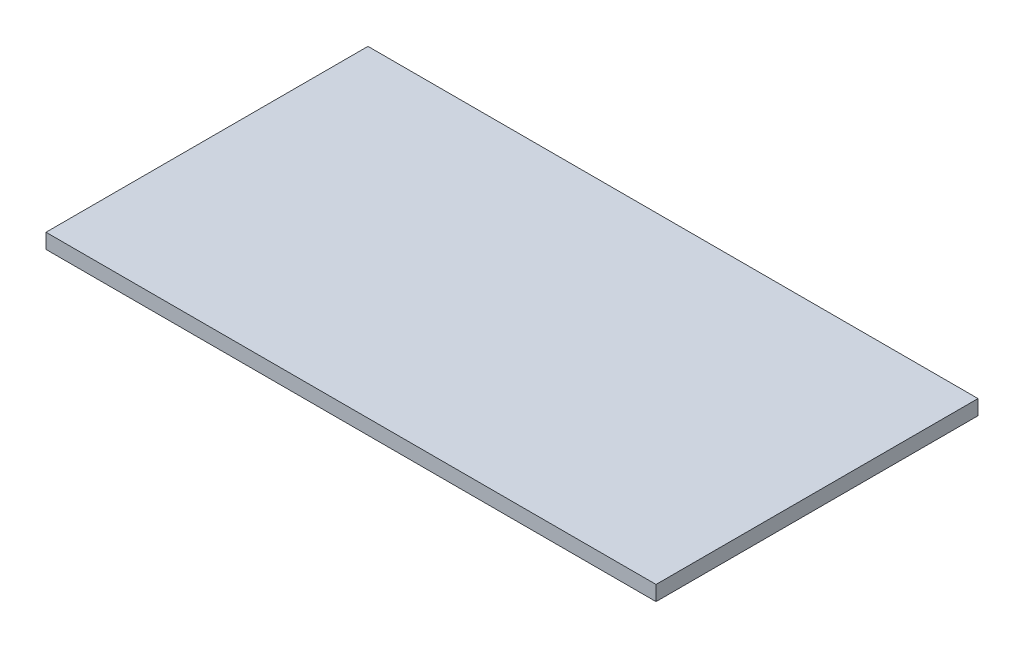
ISO-10303-21;
HEADER;
FILE_DESCRIPTION(('STEP AP214'),'2;1');
FILE_NAME('part.step','',(''),(''),'','','');
FILE_SCHEMA(('AUTOMOTIVE_DESIGN { 1 0 10303 214 1 1 1 1 }'));
ENDSEC;
DATA;
#1=APPLICATION_CONTEXT('core data for automotive mechanical design processes');
#2=APPLICATION_PROTOCOL_DEFINITION('international standard','automotive_design',2000,#1);
#3=PRODUCT_CONTEXT('',#1,'mechanical');
#4=PRODUCT('Part','Part','',(#3));
#5=PRODUCT_RELATED_PRODUCT_CATEGORY('part','',(#4));
#6=PRODUCT_DEFINITION_FORMATION('','',#4);
#7=PRODUCT_DEFINITION_CONTEXT('part definition',#1,'design');
#8=PRODUCT_DEFINITION('design','',#6,#7);
#9=PRODUCT_DEFINITION_SHAPE('','',#8);
#10=(LENGTH_UNIT() NAMED_UNIT(*) SI_UNIT(.MILLI.,.METRE.));
#11=(NAMED_UNIT(*) PLANE_ANGLE_UNIT() SI_UNIT($,.RADIAN.));
#12=(NAMED_UNIT(*) SI_UNIT($,.STERADIAN.) SOLID_ANGLE_UNIT());
#13=UNCERTAINTY_MEASURE_WITH_UNIT(LENGTH_MEASURE(1.E-05),#10,'distance_accuracy_value','');
#14=(GEOMETRIC_REPRESENTATION_CONTEXT(3) GLOBAL_UNCERTAINTY_ASSIGNED_CONTEXT((#13)) GLOBAL_UNIT_ASSIGNED_CONTEXT((#10,
#11,#12)) REPRESENTATION_CONTEXT('',''));
#15=CARTESIAN_POINT('',(0.,0.,0.));
#16=DIRECTION('',(0.,0.,1.));
#17=DIRECTION('',(1.,0.,0.));
#18=AXIS2_PLACEMENT_3D('',#15,#16,#17);
#19=CARTESIAN_POINT('',(114.3,5.588,60.325));
#20=DIRECTION('',(-1.,0.,0.));
#21=DIRECTION('',(0.,0.,1.));
#22=AXIS2_PLACEMENT_3D('',#19,#20,#21);
#23=PLANE('',#22);
#24=DIRECTION('',(0.,0.,-1.));
#25=VECTOR('',#24,1.);
#26=CARTESIAN_POINT('',(114.3,0.,60.325));
#27=LINE('',#26,#25);
#28=CARTESIAN_POINT('',(114.3,0.,60.325));
#29=VERTEX_POINT('',#28);
#30=CARTESIAN_POINT('',(114.3,0.,-60.325));
#31=VERTEX_POINT('',#30);
#32=EDGE_CURVE('E107',#29,#31,#27,.T.);
#33=ORIENTED_EDGE('',*,*,#32,.T.);
#34=DIRECTION('',(0.,-1.,0.));
#35=VECTOR('',#34,1.);
#36=CARTESIAN_POINT('',(114.3,5.588,-60.325));
#37=LINE('',#36,#35);
#38=CARTESIAN_POINT('',(114.3,5.588,-60.325));
#39=VERTEX_POINT('',#38);
#40=EDGE_CURVE('E11',#39,#31,#37,.T.);
#41=ORIENTED_EDGE('',*,*,#40,.F.);
#42=DIRECTION('',(0.,0.,-1.));
#43=VECTOR('',#42,1.);
#44=CARTESIAN_POINT('',(114.3,5.588,60.325));
#45=LINE('',#44,#43);
#46=CARTESIAN_POINT('',(114.3,5.588,60.325));
#47=VERTEX_POINT('',#46);
#48=EDGE_CURVE('E91',#47,#39,#45,.T.);
#49=ORIENTED_EDGE('',*,*,#48,.F.);
#50=DIRECTION('',(0.,-1.,0.));
#51=VECTOR('',#50,1.);
#52=CARTESIAN_POINT('',(114.3,5.588,60.325));
#53=LINE('',#52,#51);
#54=EDGE_CURVE('E103',#47,#29,#53,.T.);
#55=ORIENTED_EDGE('',*,*,#54,.T.);
#56=EDGE_LOOP('',(#33,#41,#49,#55));
#57=FACE_BOUND('',#56,.T.);
#58=ADVANCED_FACE('F39',(#57),#23,.F.);
#59=CARTESIAN_POINT('',(-114.3,5.588,-60.325));
#60=DIRECTION('',(0.,0.,1.));
#61=DIRECTION('',(1.,0.,0.));
#62=AXIS2_PLACEMENT_3D('',#59,#60,#61);
#63=PLANE('',#62);
#64=DIRECTION('',(-1.,0.,0.));
#65=VECTOR('',#64,1.);
#66=CARTESIAN_POINT('',(-114.3,0.,-60.325));
#67=LINE('',#66,#65);
#68=CARTESIAN_POINT('',(-114.3,0.,-60.325));
#69=VERTEX_POINT('',#68);
#70=EDGE_CURVE('E96',#31,#69,#67,.T.);
#71=ORIENTED_EDGE('',*,*,#70,.T.);
#72=DIRECTION('',(0.,-1.,0.));
#73=VECTOR('',#72,1.);
#74=CARTESIAN_POINT('',(-114.3,5.588,-60.325));
#75=LINE('',#74,#73);
#76=CARTESIAN_POINT('',(-114.3,5.588,-60.325));
#77=VERTEX_POINT('',#76);
#78=EDGE_CURVE('E48',#77,#69,#75,.T.);
#79=ORIENTED_EDGE('',*,*,#78,.F.);
#80=DIRECTION('',(-1.,0.,0.));
#81=VECTOR('',#80,1.);
#82=CARTESIAN_POINT('',(-114.3,5.588,-60.325));
#83=LINE('',#82,#81);
#84=EDGE_CURVE('E86',#39,#77,#83,.T.);
#85=ORIENTED_EDGE('',*,*,#84,.F.);
#86=ORIENTED_EDGE('',*,*,#40,.T.);
#87=EDGE_LOOP('',(#71,#79,#85,#86));
#88=FACE_BOUND('',#87,.T.);
#89=ADVANCED_FACE('F95',(#88),#63,.F.);
#90=CARTESIAN_POINT('',(-114.3,5.588,60.325));
#91=DIRECTION('',(1.,0.,0.));
#92=DIRECTION('',(0.,0.,-1.));
#93=AXIS2_PLACEMENT_3D('',#90,#91,#92);
#94=PLANE('',#93);
#95=DIRECTION('',(0.,0.,1.));
#96=VECTOR('',#95,1.);
#97=CARTESIAN_POINT('',(-114.3,0.,60.325));
#98=LINE('',#97,#96);
#99=CARTESIAN_POINT('',(-114.3,0.,60.325));
#100=VERTEX_POINT('',#99);
#101=EDGE_CURVE('E73',#69,#100,#98,.T.);
#102=ORIENTED_EDGE('',*,*,#101,.T.);
#103=DIRECTION('',(0.,-1.,0.));
#104=VECTOR('',#103,1.);
#105=CARTESIAN_POINT('',(-114.3,5.588,60.325));
#106=LINE('',#105,#104);
#107=CARTESIAN_POINT('',(-114.3,5.588,60.325));
#108=VERTEX_POINT('',#107);
#109=EDGE_CURVE('E98',#108,#100,#106,.T.);
#110=ORIENTED_EDGE('',*,*,#109,.F.);
#111=DIRECTION('',(0.,0.,1.));
#112=VECTOR('',#111,1.);
#113=CARTESIAN_POINT('',(-114.3,5.588,60.325));
#114=LINE('',#113,#112);
#115=EDGE_CURVE('E89',#77,#108,#114,.T.);
#116=ORIENTED_EDGE('',*,*,#115,.F.);
#117=ORIENTED_EDGE('',*,*,#78,.T.);
#118=EDGE_LOOP('',(#102,#110,#116,#117));
#119=FACE_BOUND('',#118,.T.);
#120=ADVANCED_FACE('F99',(#119),#94,.F.);
#121=CARTESIAN_POINT('',(-114.3,5.588,60.325));
#122=DIRECTION('',(0.,0.,-1.));
#123=DIRECTION('',(-1.,0.,0.));
#124=AXIS2_PLACEMENT_3D('',#121,#122,#123);
#125=PLANE('',#124);
#126=DIRECTION('',(1.,0.,0.));
#127=VECTOR('',#126,1.);
#128=CARTESIAN_POINT('',(-114.3,0.,60.325));
#129=LINE('',#128,#127);
#130=EDGE_CURVE('E79',#100,#29,#129,.T.);
#131=ORIENTED_EDGE('',*,*,#130,.T.);
#132=ORIENTED_EDGE('',*,*,#54,.F.);
#133=DIRECTION('',(1.,0.,0.));
#134=VECTOR('',#133,1.);
#135=CARTESIAN_POINT('',(-114.3,5.588,60.325));
#136=LINE('',#135,#134);
#137=EDGE_CURVE('E56',#108,#47,#136,.T.);
#138=ORIENTED_EDGE('',*,*,#137,.F.);
#139=ORIENTED_EDGE('',*,*,#109,.T.);
#140=EDGE_LOOP('',(#131,#132,#138,#139));
#141=FACE_BOUND('',#140,.T.);
#142=ADVANCED_FACE('F120',(#141),#125,.F.);
#143=CARTESIAN_POINT('',(0.,5.588,0.));
#144=DIRECTION('',(0.,-1.,0.));
#145=DIRECTION('',(0.,0.,-1.));
#146=AXIS2_PLACEMENT_3D('',#143,#144,#145);
#147=PLANE('',#146);
#148=ORIENTED_EDGE('',*,*,#48,.T.);
#149=ORIENTED_EDGE('',*,*,#84,.T.);
#150=ORIENTED_EDGE('',*,*,#115,.T.);
#151=ORIENTED_EDGE('',*,*,#137,.T.);
#152=EDGE_LOOP('',(#148,#149,#150,#151));
#153=FACE_BOUND('',#152,.T.);
#154=ADVANCED_FACE('F87',(#153),#147,.F.);
#155=CARTESIAN_POINT('',(0.,0.,0.));
#156=DIRECTION('',(0.,-1.,0.));
#157=DIRECTION('',(0.,0.,-1.));
#158=AXIS2_PLACEMENT_3D('',#155,#156,#157);
#159=PLANE('',#158);
#160=ORIENTED_EDGE('',*,*,#32,.F.);
#161=ORIENTED_EDGE('',*,*,#130,.F.);
#162=ORIENTED_EDGE('',*,*,#101,.F.);
#163=ORIENTED_EDGE('',*,*,#70,.F.);
#164=EDGE_LOOP('',(#160,#161,#162,#163));
#165=FACE_BOUND('',#164,.T.);
#166=ADVANCED_FACE('F123',(#165),#159,.T.);
#167=CLOSED_SHELL('',(#58,#89,#120,#142,#154,#166));
#168=MANIFOLD_SOLID_BREP('B2',#167);
#169=ADVANCED_BREP_SHAPE_REPRESENTATION('',(#18,#168),#14);
#170=SHAPE_DEFINITION_REPRESENTATION(#9,#169);
ENDSEC;
END-ISO-10303-21;
